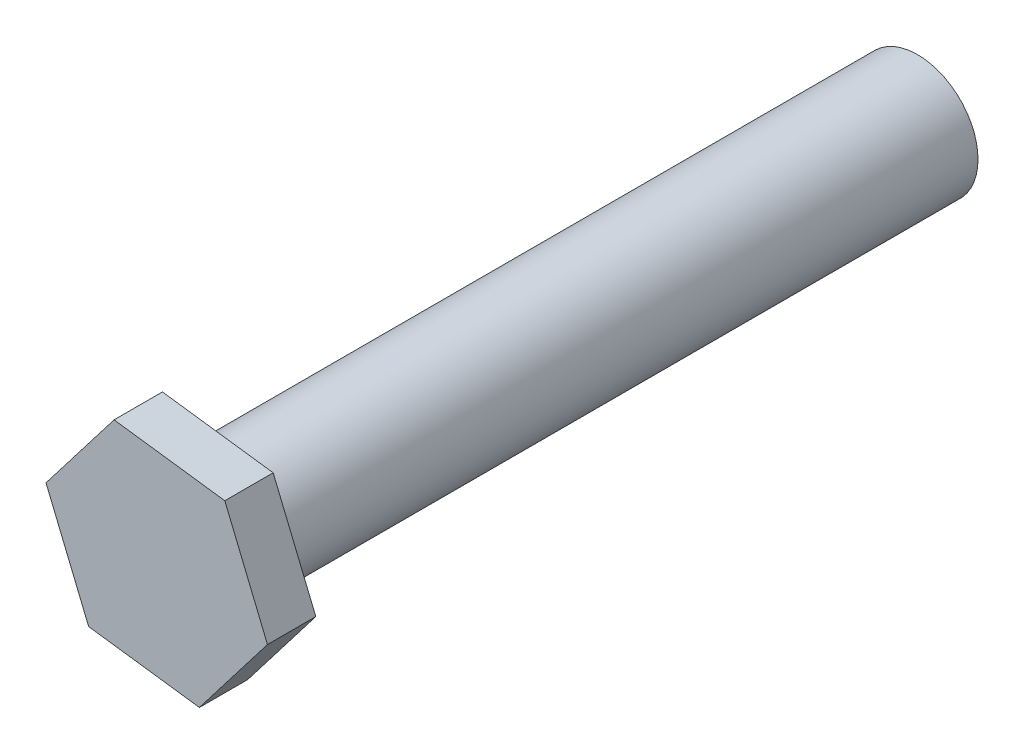
ISO-10303-21;
HEADER;
FILE_DESCRIPTION(('STEP AP214'),'2;1');
FILE_NAME('part.step','',(''),(''),'','','');
FILE_SCHEMA(('AUTOMOTIVE_DESIGN { 1 0 10303 214 1 1 1 1 }'));
ENDSEC;
DATA;
#1=APPLICATION_CONTEXT('core data for automotive mechanical design processes');
#2=APPLICATION_PROTOCOL_DEFINITION('international standard','automotive_design',2000,#1);
#3=PRODUCT_CONTEXT('',#1,'mechanical');
#4=PRODUCT('Part','Part','',(#3));
#5=PRODUCT_RELATED_PRODUCT_CATEGORY('part','',(#4));
#6=PRODUCT_DEFINITION_FORMATION('','',#4);
#7=PRODUCT_DEFINITION_CONTEXT('part definition',#1,'design');
#8=PRODUCT_DEFINITION('design','',#6,#7);
#9=PRODUCT_DEFINITION_SHAPE('','',#8);
#10=(LENGTH_UNIT() NAMED_UNIT(*) SI_UNIT(.MILLI.,.METRE.));
#11=(NAMED_UNIT(*) PLANE_ANGLE_UNIT() SI_UNIT($,.RADIAN.));
#12=(NAMED_UNIT(*) SI_UNIT($,.STERADIAN.) SOLID_ANGLE_UNIT());
#13=UNCERTAINTY_MEASURE_WITH_UNIT(LENGTH_MEASURE(1.E-05),#10,'distance_accuracy_value','');
#14=(GEOMETRIC_REPRESENTATION_CONTEXT(3) GLOBAL_UNCERTAINTY_ASSIGNED_CONTEXT((#13)) GLOBAL_UNIT_ASSIGNED_CONTEXT((#10,
#11,#12)) REPRESENTATION_CONTEXT('',''));
#15=CARTESIAN_POINT('',(0.,0.,0.));
#16=DIRECTION('',(0.,0.,1.));
#17=DIRECTION('',(1.,0.,0.));
#18=AXIS2_PLACEMENT_3D('',#15,#16,#17);
#19=CARTESIAN_POINT('',(0.,0.,-34.6));
#20=DIRECTION('',(0.,0.,1.));
#21=DIRECTION('',(1.,0.,0.));
#22=AXIS2_PLACEMENT_3D('',#19,#20,#21);
#23=CYLINDRICAL_SURFACE('',#22,25.);
#24=CARTESIAN_POINT('',(0.,0.,-34.6));
#25=DIRECTION('',(0.,0.,1.));
#26=DIRECTION('',(1.,0.,0.));
#27=AXIS2_PLACEMENT_3D('',#24,#25,#26);
#28=CIRCLE('',#27,25.);
#29=CARTESIAN_POINT('',(25.,0.,-34.6));
#30=VERTEX_POINT('',#29);
#31=EDGE_CURVE('E11',#30,#30,#28,.T.);
#32=ORIENTED_EDGE('',*,*,#31,.T.);
#33=EDGE_LOOP('',(#32));
#34=FACE_BOUND('',#33,.T.);
#35=CARTESIAN_POINT('',(0.,0.,260.));
#36=DIRECTION('',(0.,0.,1.));
#37=DIRECTION('',(1.,0.,0.));
#38=AXIS2_PLACEMENT_3D('',#35,#36,#37);
#39=CIRCLE('',#38,25.);
#40=CARTESIAN_POINT('',(25.,0.,260.));
#41=VERTEX_POINT('',#40);
#42=EDGE_CURVE('E41',#41,#41,#39,.T.);
#43=ORIENTED_EDGE('',*,*,#42,.F.);
#44=EDGE_LOOP('',(#43));
#45=FACE_BOUND('',#44,.T.);
#46=ADVANCED_FACE('F33',(#34,#45),#23,.T.);
#47=CARTESIAN_POINT('',(0.,0.,-34.6));
#48=DIRECTION('',(0.,0.,1.));
#49=DIRECTION('',(1.,0.,0.));
#50=AXIS2_PLACEMENT_3D('',#47,#48,#49);
#51=PLANE('',#50);
#52=ORIENTED_EDGE('',*,*,#31,.F.);
#53=EDGE_LOOP('',(#52));
#54=FACE_BOUND('',#53,.T.);
#55=ADVANCED_FACE('F143',(#54),#51,.F.);
#56=CARTESIAN_POINT('',(45.7878177547294,-6.06704858996732,280.));
#57=DIRECTION('',(-0.924199310462504,-0.38191050593121,0.));
#58=DIRECTION('',(0.38191050593121,-0.924199310462504,0.));
#59=AXIS2_PLACEMENT_3D('',#56,#57,#58);
#60=PLANE('',#59);
#61=DIRECTION('',(-0.38191050593121,0.924199310462504,0.));
#62=VECTOR('',#61,1.);
#63=CARTESIAN_POINT('',(45.7878177547294,-6.06704858996732,260.));
#64=LINE('',#63,#62);
#65=CARTESIAN_POINT('',(45.7878177547294,-6.06704858996732,260.));
#66=VERTEX_POINT('',#65);
#67=CARTESIAN_POINT('',(28.1481270822709,36.6198890644641,260.));
#68=VERTEX_POINT('',#67);
#69=EDGE_CURVE('E118',#66,#68,#64,.T.);
#70=ORIENTED_EDGE('',*,*,#69,.T.);
#71=DIRECTION('',(0.,0.,-1.));
#72=VECTOR('',#71,1.);
#73=CARTESIAN_POINT('',(28.1481270822709,36.6198890644641,280.));
#74=LINE('',#73,#72);
#75=CARTESIAN_POINT('',(28.1481270822709,36.6198890644641,280.));
#76=VERTEX_POINT('',#75);
#77=EDGE_CURVE('E135',#76,#68,#74,.T.);
#78=ORIENTED_EDGE('',*,*,#77,.F.);
#79=DIRECTION('',(-0.38191050593121,0.924199310462504,0.));
#80=VECTOR('',#79,1.);
#81=CARTESIAN_POINT('',(45.7878177547294,-6.06704858996732,280.));
#82=LINE('',#81,#80);
#83=CARTESIAN_POINT('',(45.7878177547294,-6.06704858996732,280.));
#84=VERTEX_POINT('',#83);
#85=EDGE_CURVE('E128',#84,#76,#82,.T.);
#86=ORIENTED_EDGE('',*,*,#85,.F.);
#87=DIRECTION('',(0.,0.,-1.));
#88=VECTOR('',#87,1.);
#89=CARTESIAN_POINT('',(45.7878177547294,-6.06704858996732,280.));
#90=LINE('',#89,#88);
#91=EDGE_CURVE('E114',#84,#66,#90,.T.);
#92=ORIENTED_EDGE('',*,*,#91,.T.);
#93=EDGE_LOOP('',(#70,#78,#86,#92));
#94=FACE_BOUND('',#93,.T.);
#95=ADVANCED_FACE('F148',(#94),#60,.F.);
#96=CARTESIAN_POINT('',(28.1481270822709,36.6198890644641,280.));
#97=DIRECTION('',(-0.131355455122657,-0.991335333986195,0.));
#98=DIRECTION('',(0.991335333986195,-0.131355455122657,0.));
#99=AXIS2_PLACEMENT_3D('',#96,#97,#98);
#100=PLANE('',#99);
#101=DIRECTION('',(-0.991335333986194,0.131355455122657,0.));
#102=VECTOR('',#101,1.);
#103=CARTESIAN_POINT('',(28.1481270822709,36.6198890644641,260.));
#104=LINE('',#103,#102);
#105=CARTESIAN_POINT('',(-17.6396906724584,42.6869376544314,260.));
#106=VERTEX_POINT('',#105);
#107=EDGE_CURVE('E121',#68,#106,#104,.T.);
#108=ORIENTED_EDGE('',*,*,#107,.T.);
#109=DIRECTION('',(0.,0.,-1.));
#110=VECTOR('',#109,1.);
#111=CARTESIAN_POINT('',(-17.6396906724584,42.6869376544314,280.));
#112=LINE('',#111,#110);
#113=CARTESIAN_POINT('',(-17.6396906724584,42.6869376544314,280.));
#114=VERTEX_POINT('',#113);
#115=EDGE_CURVE('E132',#114,#106,#112,.T.);
#116=ORIENTED_EDGE('',*,*,#115,.F.);
#117=DIRECTION('',(-0.991335333986194,0.131355455122657,0.));
#118=VECTOR('',#117,1.);
#119=CARTESIAN_POINT('',(28.1481270822709,36.6198890644641,280.));
#120=LINE('',#119,#118);
#121=EDGE_CURVE('E87',#76,#114,#120,.T.);
#122=ORIENTED_EDGE('',*,*,#121,.F.);
#123=ORIENTED_EDGE('',*,*,#77,.T.);
#124=EDGE_LOOP('',(#108,#116,#122,#123));
#125=FACE_BOUND('',#124,.T.);
#126=ADVANCED_FACE('F154',(#125),#100,.F.);
#127=CARTESIAN_POINT('',(-17.6396906724584,42.6869376544314,280.));
#128=DIRECTION('',(0.792843855339847,-0.609424828054984,0.));
#129=DIRECTION('',(0.609424828054984,0.792843855339847,0.));
#130=AXIS2_PLACEMENT_3D('',#127,#128,#129);
#131=PLANE('',#130);
#132=DIRECTION('',(-0.609424828054984,-0.792843855339847,0.));
#133=VECTOR('',#132,1.);
#134=CARTESIAN_POINT('',(-17.6396906724584,42.6869376544314,260.));
#135=LINE('',#134,#133);
#136=CARTESIAN_POINT('',(-45.7878177547294,6.06704858996731,260.));
#137=VERTEX_POINT('',#136);
#138=EDGE_CURVE('E123',#106,#137,#135,.T.);
#139=ORIENTED_EDGE('',*,*,#138,.T.);
#140=DIRECTION('',(0.,0.,-1.));
#141=VECTOR('',#140,1.);
#142=CARTESIAN_POINT('',(-45.7878177547294,6.06704858996731,280.));
#143=LINE('',#142,#141);
#144=CARTESIAN_POINT('',(-45.7878177547294,6.06704858996731,280.));
#145=VERTEX_POINT('',#144);
#146=EDGE_CURVE('E109',#145,#137,#143,.T.);
#147=ORIENTED_EDGE('',*,*,#146,.F.);
#148=DIRECTION('',(-0.609424828054984,-0.792843855339847,0.));
#149=VECTOR('',#148,1.);
#150=CARTESIAN_POINT('',(-17.6396906724584,42.6869376544314,280.));
#151=LINE('',#150,#149);
#152=EDGE_CURVE('E100',#114,#145,#151,.T.);
#153=ORIENTED_EDGE('',*,*,#152,.F.);
#154=ORIENTED_EDGE('',*,*,#115,.T.);
#155=EDGE_LOOP('',(#139,#147,#153,#154));
#156=FACE_BOUND('',#155,.T.);
#157=ADVANCED_FACE('F160',(#156),#131,.F.);
#158=CARTESIAN_POINT('',(-45.7878177547294,6.06704858996731,280.));
#159=DIRECTION('',(0.924199310462504,0.38191050593121,0.));
#160=DIRECTION('',(-0.38191050593121,0.924199310462504,0.));
#161=AXIS2_PLACEMENT_3D('',#158,#159,#160);
#162=PLANE('',#161);
#163=DIRECTION('',(0.38191050593121,-0.924199310462504,0.));
#164=VECTOR('',#163,1.);
#165=CARTESIAN_POINT('',(-45.7878177547294,6.06704858996731,260.));
#166=LINE('',#165,#164);
#167=CARTESIAN_POINT('',(-28.1481270822709,-36.6198890644641,260.));
#168=VERTEX_POINT('',#167);
#169=EDGE_CURVE('E108',#137,#168,#166,.T.);
#170=ORIENTED_EDGE('',*,*,#169,.T.);
#171=DIRECTION('',(0.,0.,-1.));
#172=VECTOR('',#171,1.);
#173=CARTESIAN_POINT('',(-28.1481270822709,-36.6198890644641,280.));
#174=LINE('',#173,#172);
#175=CARTESIAN_POINT('',(-28.1481270822709,-36.6198890644641,280.));
#176=VERTEX_POINT('',#175);
#177=EDGE_CURVE('E105',#176,#168,#174,.T.);
#178=ORIENTED_EDGE('',*,*,#177,.F.);
#179=DIRECTION('',(0.38191050593121,-0.924199310462504,0.));
#180=VECTOR('',#179,1.);
#181=CARTESIAN_POINT('',(-45.7878177547294,6.06704858996731,280.));
#182=LINE('',#181,#180);
#183=EDGE_CURVE('E94',#145,#176,#182,.T.);
#184=ORIENTED_EDGE('',*,*,#183,.F.);
#185=ORIENTED_EDGE('',*,*,#146,.T.);
#186=EDGE_LOOP('',(#170,#178,#184,#185));
#187=FACE_BOUND('',#186,.T.);
#188=ADVANCED_FACE('F106',(#187),#162,.F.);
#189=CARTESIAN_POINT('',(-28.1481270822709,-36.6198890644641,280.));
#190=DIRECTION('',(0.131355455122656,0.991335333986195,0.));
#191=DIRECTION('',(-0.991335333986195,0.131355455122656,0.));
#192=AXIS2_PLACEMENT_3D('',#189,#190,#191);
#193=PLANE('',#192);
#194=DIRECTION('',(0.991335333986194,-0.131355455122656,0.));
#195=VECTOR('',#194,1.);
#196=CARTESIAN_POINT('',(-28.1481270822709,-36.6198890644641,260.));
#197=LINE('',#196,#195);
#198=CARTESIAN_POINT('',(17.6396906724584,-42.6869376544314,260.));
#199=VERTEX_POINT('',#198);
#200=EDGE_CURVE('E72',#168,#199,#197,.T.);
#201=ORIENTED_EDGE('',*,*,#200,.T.);
#202=DIRECTION('',(0.,0.,-1.));
#203=VECTOR('',#202,1.);
#204=CARTESIAN_POINT('',(17.6396906724584,-42.6869376544314,280.));
#205=LINE('',#204,#203);
#206=CARTESIAN_POINT('',(17.6396906724584,-42.6869376544314,280.));
#207=VERTEX_POINT('',#206);
#208=EDGE_CURVE('E110',#207,#199,#205,.T.);
#209=ORIENTED_EDGE('',*,*,#208,.F.);
#210=DIRECTION('',(0.991335333986194,-0.131355455122656,0.));
#211=VECTOR('',#210,1.);
#212=CARTESIAN_POINT('',(-28.1481270822709,-36.6198890644641,280.));
#213=LINE('',#212,#211);
#214=EDGE_CURVE('E98',#176,#207,#213,.T.);
#215=ORIENTED_EDGE('',*,*,#214,.F.);
#216=ORIENTED_EDGE('',*,*,#177,.T.);
#217=EDGE_LOOP('',(#201,#209,#215,#216));
#218=FACE_BOUND('',#217,.T.);
#219=ADVANCED_FACE('F112',(#218),#193,.F.);
#220=CARTESIAN_POINT('',(17.6396906724584,-42.6869376544314,280.));
#221=DIRECTION('',(-0.792843855339847,0.609424828054984,0.));
#222=DIRECTION('',(-0.609424828054984,-0.792843855339847,0.));
#223=AXIS2_PLACEMENT_3D('',#220,#221,#222);
#224=PLANE('',#223);
#225=DIRECTION('',(0.609424828054984,0.792843855339847,0.));
#226=VECTOR('',#225,1.);
#227=CARTESIAN_POINT('',(17.6396906724584,-42.6869376544314,260.));
#228=LINE('',#227,#226);
#229=EDGE_CURVE('E78',#199,#66,#228,.T.);
#230=ORIENTED_EDGE('',*,*,#229,.T.);
#231=ORIENTED_EDGE('',*,*,#91,.F.);
#232=DIRECTION('',(0.609424828054984,0.792843855339847,0.));
#233=VECTOR('',#232,1.);
#234=CARTESIAN_POINT('',(17.6396906724584,-42.6869376544314,280.));
#235=LINE('',#234,#233);
#236=EDGE_CURVE('E49',#207,#84,#235,.T.);
#237=ORIENTED_EDGE('',*,*,#236,.F.);
#238=ORIENTED_EDGE('',*,*,#208,.T.);
#239=EDGE_LOOP('',(#230,#231,#237,#238));
#240=FACE_BOUND('',#239,.T.);
#241=ADVANCED_FACE('F168',(#240),#224,.F.);
#242=CARTESIAN_POINT('',(0.,0.,280.));
#243=DIRECTION('',(0.,0.,1.));
#244=DIRECTION('',(1.,0.,0.));
#245=AXIS2_PLACEMENT_3D('',#242,#243,#244);
#246=PLANE('',#245);
#247=ORIENTED_EDGE('',*,*,#85,.T.);
#248=ORIENTED_EDGE('',*,*,#121,.T.);
#249=ORIENTED_EDGE('',*,*,#152,.T.);
#250=ORIENTED_EDGE('',*,*,#183,.T.);
#251=ORIENTED_EDGE('',*,*,#214,.T.);
#252=ORIENTED_EDGE('',*,*,#236,.T.);
#253=EDGE_LOOP('',(#247,#248,#249,#250,#251,#252));
#254=FACE_BOUND('',#253,.T.);
#255=ADVANCED_FACE('F96',(#254),#246,.T.);
#256=CARTESIAN_POINT('',(0.,0.,260.));
#257=DIRECTION('',(0.,0.,1.));
#258=DIRECTION('',(1.,0.,0.));
#259=AXIS2_PLACEMENT_3D('',#256,#257,#258);
#260=PLANE('',#259);
#261=ORIENTED_EDGE('',*,*,#42,.T.);
#262=EDGE_LOOP('',(#261));
#263=FACE_BOUND('',#262,.T.);
#264=ORIENTED_EDGE('',*,*,#69,.F.);
#265=ORIENTED_EDGE('',*,*,#229,.F.);
#266=ORIENTED_EDGE('',*,*,#200,.F.);
#267=ORIENTED_EDGE('',*,*,#169,.F.);
#268=ORIENTED_EDGE('',*,*,#138,.F.);
#269=ORIENTED_EDGE('',*,*,#107,.F.);
#270=EDGE_LOOP('',(#264,#265,#266,#267,#268,#269));
#271=FACE_BOUND('',#270,.T.);
#272=ADVANCED_FACE('F139',(#263,#271),#260,.F.);
#273=CLOSED_SHELL('',(#46,#55,#95,#126,#157,#188,#219,#241,#255,#272));
#274=MANIFOLD_SOLID_BREP('B2',#273);
#275=ADVANCED_BREP_SHAPE_REPRESENTATION('',(#18,#274),#14);
#276=SHAPE_DEFINITION_REPRESENTATION(#9,#275);
ENDSEC;
END-ISO-10303-21;
